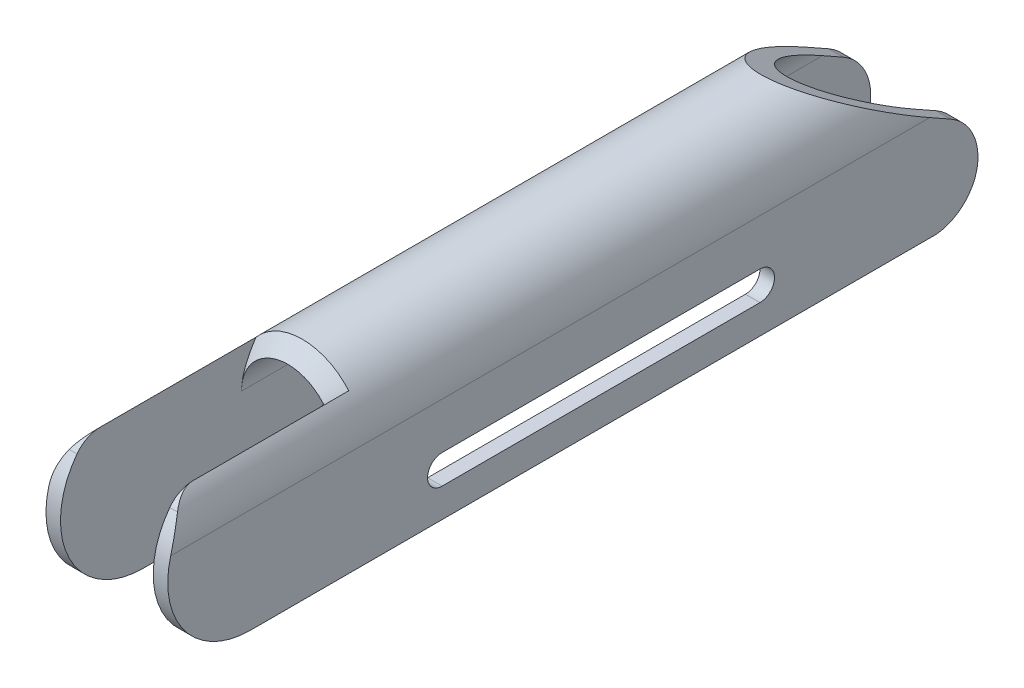
ISO-10303-21;
HEADER;
FILE_DESCRIPTION(('STEP AP214'),'2;1');
FILE_NAME('part.step','',(''),(''),'','','');
FILE_SCHEMA(('AUTOMOTIVE_DESIGN { 1 0 10303 214 1 1 1 1 }'));
ENDSEC;
DATA;
#1=APPLICATION_CONTEXT('core data for automotive mechanical design processes');
#2=APPLICATION_PROTOCOL_DEFINITION('international standard','automotive_design',2000,#1);
#3=PRODUCT_CONTEXT('',#1,'mechanical');
#4=PRODUCT('Part','Part','',(#3));
#5=PRODUCT_RELATED_PRODUCT_CATEGORY('part','',(#4));
#6=PRODUCT_DEFINITION_FORMATION('','',#4);
#7=PRODUCT_DEFINITION_CONTEXT('part definition',#1,'design');
#8=PRODUCT_DEFINITION('design','',#6,#7);
#9=PRODUCT_DEFINITION_SHAPE('','',#8);
#10=(LENGTH_UNIT() NAMED_UNIT(*) SI_UNIT(.MILLI.,.METRE.));
#11=(NAMED_UNIT(*) PLANE_ANGLE_UNIT() SI_UNIT($,.RADIAN.));
#12=(NAMED_UNIT(*) SI_UNIT($,.STERADIAN.) SOLID_ANGLE_UNIT());
#13=UNCERTAINTY_MEASURE_WITH_UNIT(LENGTH_MEASURE(1.E-05),#10,'distance_accuracy_value','');
#14=(GEOMETRIC_REPRESENTATION_CONTEXT(3) GLOBAL_UNCERTAINTY_ASSIGNED_CONTEXT((#13)) GLOBAL_UNIT_ASSIGNED_CONTEXT((#10,
#11,#12)) REPRESENTATION_CONTEXT('',''));
#15=CARTESIAN_POINT('',(0.,0.,0.));
#16=DIRECTION('',(0.,0.,1.));
#17=DIRECTION('',(1.,0.,0.));
#18=AXIS2_PLACEMENT_3D('',#15,#16,#17);
#19=CARTESIAN_POINT('',(0.,-7.50000000000001,-29.));
#20=DIRECTION('',(1.,0.,0.));
#21=DIRECTION('',(0.,1.,0.));
#22=AXIS2_PLACEMENT_3D('',#19,#20,#21);
#23=CYLINDRICAL_SURFACE('',#22,28.5);
#24=CARTESIAN_POINT('',(42.,0.,-1.50454583026493));
#25=CARTESIAN_POINT('',(42.0000078379844,0.281470430875846,-1.58131301805682));
#26=CARTESIAN_POINT('',(41.9943413318674,0.561740207267291,-1.66241637302954));
#27=CARTESIAN_POINT('',(41.9720066577336,1.11922274394459,-1.83303817373724));
#28=CARTESIAN_POINT('',(41.9553400441765,1.3964359305401,-1.92255542894493));
#29=CARTESIAN_POINT('',(41.9113797237989,1.9468821738609,-2.10965157391276));
#30=CARTESIAN_POINT('',(41.8840994447651,2.22011980888742,-2.20722015520436));
#31=CARTESIAN_POINT('',(41.819309776778,2.76241562024756,-2.41021454650773));
#32=CARTESIAN_POINT('',(41.7818000618385,3.03147366309939,-2.51564060683947));
#33=CARTESIAN_POINT('',(41.655331928854,3.82666973610311,-2.84120938033964));
#34=CARTESIAN_POINT('',(41.5519985119814,4.34609315288129,-3.07243830644598));
#35=CARTESIAN_POINT('',(41.3102299484671,5.36360743197751,-3.56190490619865));
#36=CARTESIAN_POINT('',(41.1717841069802,5.86169174051702,-3.82015079479918));
#37=CARTESIAN_POINT('',(40.8641394191691,6.83180401780029,-4.35946882580729));
#38=CARTESIAN_POINT('',(40.6951034497619,7.30395350367233,-4.64041590857864));
#39=CARTESIAN_POINT('',(40.3292172039968,8.22351884394188,-5.22359514287313));
#40=CARTESIAN_POINT('',(40.1323696194308,8.67093708616892,-5.52582523306799));
#41=CARTESIAN_POINT('',(39.7135032403053,9.54141885497119,-6.14988940163068));
#42=CARTESIAN_POINT('',(39.4914233646026,9.96441937585143,-6.47177013970007));
#43=CARTESIAN_POINT('',(39.0253876652276,10.7846170413226,-7.13221207385049));
#44=CARTESIAN_POINT('',(38.7814267605344,11.1818081555614,-7.47077713595265));
#45=CARTESIAN_POINT('',(38.1285666021884,12.1711864215096,-8.36127340563184));
#46=CARTESIAN_POINT('',(37.7054236615783,12.7443192799115,-8.92404905873861));
#47=CARTESIAN_POINT('',(36.8203708950797,13.8277090342549,-10.0789451296059));
#48=CARTESIAN_POINT('',(36.3584438011644,14.3379376708624,-10.6710785698923));
#49=CARTESIAN_POINT('',(35.4022717268348,15.2981857726764,-11.880134625509));
#50=CARTESIAN_POINT('',(34.9079644930189,15.748083870486,-12.497104057161));
#51=CARTESIAN_POINT('',(33.893976738655,16.5885199433872,-13.7500072652915));
#52=CARTESIAN_POINT('',(33.3742971804384,16.9790601675199,-14.3859403221548));
#53=CARTESIAN_POINT('',(32.1232867617891,17.8335413503409,-15.905293018601));
#54=CARTESIAN_POINT('',(31.3832185479532,18.2731563267866,-16.7952528643429));
#55=CARTESIAN_POINT('',(29.8752918749372,19.051229488021,-18.5959291787661));
#56=CARTESIAN_POINT('',(29.107420673625,19.3896406159593,-19.5066550919103));
#57=CARTESIAN_POINT('',(27.5534414852356,19.9684477790964,-21.3411372421391));
#58=CARTESIAN_POINT('',(26.7673594796596,20.2089753381149,-22.2648742571665));
#59=CARTESIAN_POINT('',(25.1832407905418,20.5952591794473,-24.1210218038153));
#60=CARTESIAN_POINT('',(24.385210839267,20.7410669187981,-25.053427346478));
#61=CARTESIAN_POINT('',(23.1582075958513,20.8932138760748,-26.4850037652716));
#62=CARTESIAN_POINT('',(22.7313279510348,20.9328891607137,-26.9826808363621));
#63=CARTESIAN_POINT('',(21.8769468586524,20.9860433475811,-27.9783847655471));
#64=CARTESIAN_POINT('',(21.4494460695991,20.9995408684445,-28.4764111228283));
#65=CARTESIAN_POINT('',(21.0146611411726,20.9999961612058,-28.9829202873666));
#66=CARTESIAN_POINT('',(21.0073305624724,20.9999999995566,-28.9914601531068));
#67=CARTESIAN_POINT('',(21.,21.,-29.));
#68=B_SPLINE_CURVE_WITH_KNOTS('',3,(#24,#25,#26,#27,#28,#29,#30,#31,#32,#33,#34,#35,#36,#37,#38,
#39,#40,#41,#42,#43,#44,#45,#46,#47,#48,#49,#50,#51,#52,#53,#54,#55,#56,#57,#58,#59,#60,#61,#62,
#63,#64,#65,#66,#67),.UNSPECIFIED.,.F.,.F.,(4,2,2,2,2,2,2,2,2,2,2,2,2,2,2,2,2,2,2,2,2,4),(0.,
0.875137417471462,1.75015119299242,2.62406153347569,3.49799972650496,5.22920387958742,
6.96093597237464,8.68370514364832,10.4063076880212,12.1331728345623,13.8604400219594,
16.5799329245868,19.3006431249376,22.0267470178365,24.7527475942157,28.461893447742,
32.1727612744409,35.8786263008895,39.5824764094682,41.5526850445835,43.5214918767296,
43.5552557647255),.UNSPECIFIED.);
#69=CARTESIAN_POINT('',(39.6760943348516,9.60226537832217,-6.20169920960243));
#70=VERTEX_POINT('',#69);
#71=CARTESIAN_POINT('',(42.,0.,-1.50454583026496));
#72=VERTEX_POINT('',#71);
#73=EDGE_CURVE('E386',#70,#72,#68,.F.);
#74=ORIENTED_EDGE('',*,*,#73,.F.);
#75=DIRECTION('',(-1.,0.,0.));
#76=VECTOR('',#75,1.);
#77=CARTESIAN_POINT('',(42.,9.60226537832218,-6.20169920960243));
#78=LINE('',#77,#76);
#79=CARTESIAN_POINT('',(37.,9.60226537832218,-6.20169920960243));
#80=VERTEX_POINT('',#79);
#81=EDGE_CURVE('E283',#70,#80,#78,.T.);
#82=ORIENTED_EDGE('',*,*,#81,.T.);
#83=CARTESIAN_POINT('',(37.,-7.5,-29.));
#84=DIRECTION('',(1.,0.,0.));
#85=DIRECTION('',(0.,0.,-1.));
#86=AXIS2_PLACEMENT_3D('',#83,#84,#85);
#87=CIRCLE('',#86,28.5);
#88=CARTESIAN_POINT('',(37.,-36.,-29.));
#89=VERTEX_POINT('',#88);
#90=EDGE_CURVE('E460',#89,#80,#87,.F.);
#91=ORIENTED_EDGE('',*,*,#90,.F.);
#92=DIRECTION('',(1.,0.,0.));
#93=VECTOR('',#92,1.);
#94=CARTESIAN_POINT('',(0.,-36.,-29.));
#95=LINE('',#94,#93);
#96=CARTESIAN_POINT('',(42.,-36.,-29.));
#97=VERTEX_POINT('',#96);
#98=EDGE_CURVE('E380',#89,#97,#95,.T.);
#99=ORIENTED_EDGE('',*,*,#98,.T.);
#100=CARTESIAN_POINT('',(42.,-7.5,-29.));
#101=DIRECTION('',(1.,0.,0.));
#102=DIRECTION('',(0.,1.,0.));
#103=AXIS2_PLACEMENT_3D('',#100,#101,#102);
#104=CIRCLE('',#103,28.5);
#105=EDGE_CURVE('E371',#72,#97,#104,.T.);
#106=ORIENTED_EDGE('',*,*,#105,.F.);
#107=EDGE_LOOP('',(#74,#82,#91,#99,#106));
#108=FACE_BOUND('',#107,.T.);
#109=ADVANCED_FACE('F57',(#108),#23,.T.);
#110=CARTESIAN_POINT('',(37.,0.,-0.5));
#111=DIRECTION('',(1.,0.,0.));
#112=DIRECTION('',(0.,0.,-1.));
#113=AXIS2_PLACEMENT_3D('',#110,#111,#112);
#114=PLANE('',#113);
#115=DIRECTION('',(0.,0.,-1.));
#116=VECTOR('',#115,1.);
#117=CARTESIAN_POINT('',(37.,-25.9821866375263,-0.5));
#118=LINE('',#117,#116);
#119=CARTESIAN_POINT('',(37.,-25.9821866375263,-95.14093430841));
#120=VERTEX_POINT('',#119);
#121=CARTESIAN_POINT('',(37.,-25.9821866375263,-204.781024531025));
#122=VERTEX_POINT('',#121);
#123=EDGE_CURVE('E267',#120,#122,#118,.T.);
#124=ORIENTED_EDGE('',*,*,#123,.T.);
#125=CARTESIAN_POINT('',(37.,-20.9700682273497,-204.781024531025));
#126=DIRECTION('',(1.,0.,0.));
#127=DIRECTION('',(0.,0.,-1.));
#128=AXIS2_PLACEMENT_3D('',#125,#126,#127);
#129=CIRCLE('',#128,5.01211841017668);
#130=CARTESIAN_POINT('',(37.,-15.957949817173,-204.781024531025));
#131=VERTEX_POINT('',#130);
#132=EDGE_CURVE('E225',#122,#131,#129,.T.);
#133=ORIENTED_EDGE('',*,*,#132,.T.);
#134=DIRECTION('',(0.,0.,-1.));
#135=VECTOR('',#134,1.);
#136=CARTESIAN_POINT('',(37.,-15.957949817173,-0.5));
#137=LINE('',#136,#135);
#138=CARTESIAN_POINT('',(37.,-15.957949817173,-95.14093430841));
#139=VERTEX_POINT('',#138);
#140=EDGE_CURVE('E277',#139,#131,#137,.T.);
#141=ORIENTED_EDGE('',*,*,#140,.F.);
#142=CARTESIAN_POINT('',(37.,-20.9700682273497,-95.14093430841));
#143=DIRECTION('',(1.,0.,0.));
#144=DIRECTION('',(0.,0.,-1.));
#145=AXIS2_PLACEMENT_3D('',#142,#143,#144);
#146=CIRCLE('',#145,5.01211841017668);
#147=EDGE_CURVE('E272',#139,#120,#146,.T.);
#148=ORIENTED_EDGE('',*,*,#147,.T.);
#149=EDGE_LOOP('',(#124,#133,#141,#148));
#150=FACE_BOUND('',#149,.T.);
#151=CARTESIAN_POINT('',(37.,3.60147050873545,-14.2011029957068));
#152=DIRECTION('',(1.,0.,0.));
#153=DIRECTION('',(0.,0.,-1.));
#154=AXIS2_PLACEMENT_3D('',#151,#152,#153);
#155=CIRCLE('',#154,10.);
#156=CARTESIAN_POINT('',(37.,13.6014705087355,-14.2011029957068));
#157=VERTEX_POINT('',#156);
#158=EDGE_CURVE('E318',#157,#80,#155,.T.);
#159=ORIENTED_EDGE('',*,*,#158,.F.);
#160=DIRECTION('',(0.,0.,1.));
#161=VECTOR('',#160,1.);
#162=CARTESIAN_POINT('',(37.,13.6014705087354,-280.));
#163=LINE('',#162,#161);
#164=CARTESIAN_POINT('',(37.,13.6014705087354,-67.9421378990617));
#165=VERTEX_POINT('',#164);
#166=EDGE_CURVE('E323',#157,#165,#163,.F.);
#167=ORIENTED_EDGE('',*,*,#166,.T.);
#168=CARTESIAN_POINT('',(37.,13.6014705087354,-67.9421378990617));
#169=CARTESIAN_POINT('',(37.,13.263718050929,-67.723419434942));
#170=CARTESIAN_POINT('',(37.,12.9238178955374,-67.507962041322));
#171=CARTESIAN_POINT('',(37.,12.2391410477654,-67.0847220094933));
#172=CARTESIAN_POINT('',(37.,11.8943629618573,-66.876941628283));
#173=CARTESIAN_POINT('',(37.,11.197840655012,-66.4693395300177));
#174=CARTESIAN_POINT('',(37.,10.8460705509863,-66.2695618749321));
#175=CARTESIAN_POINT('',(37.,10.1367444516397,-65.8806063789175));
#176=CARTESIAN_POINT('',(37.,9.77918895601471,-65.6914276287719));
#177=CARTESIAN_POINT('',(37.,9.06890906215404,-65.3311128584169));
#178=CARTESIAN_POINT('',(37.,8.71637729146691,-65.1595997599552));
#179=CARTESIAN_POINT('',(37.,8.00503153134776,-64.8301536421173));
#180=CARTESIAN_POINT('',(37.,7.64621695598859,-64.6722218975288));
#181=CARTESIAN_POINT('',(37.,6.56114402741744,-64.222645529841));
#182=CARTESIAN_POINT('',(37.,5.82471260692834,-63.9544161610302));
#183=CARTESIAN_POINT('',(37.,4.66796143282101,-63.6046342050249));
#184=CARTESIAN_POINT('',(37.,4.25642521324329,-63.4936989703165));
#185=CARTESIAN_POINT('',(37.,3.42668837391906,-63.3000015297154));
#186=CARTESIAN_POINT('',(37.,3.00848877864559,-63.2172350358956));
#187=CARTESIAN_POINT('',(37.,2.37411761174278,-63.1159380780384));
#188=CARTESIAN_POINT('',(37.,2.15974395706909,-63.0858353727216));
#189=CARTESIAN_POINT('',(37.,1.72998061884875,-63.0339791563646));
#190=CARTESIAN_POINT('',(37.,1.51459095692613,-63.0122254684338));
#191=CARTESIAN_POINT('',(37.,1.0828576108131,-62.9772950572886));
#192=CARTESIAN_POINT('',(37.,0.866513093271172,-62.9641286318523));
#193=CARTESIAN_POINT('',(37.,0.433447638017115,-62.9465409356701));
#194=CARTESIAN_POINT('',(37.,0.216726664310944,-62.9421205531201));
#195=CARTESIAN_POINT('',(37.,0.,-62.9421378990618));
#196=B_SPLINE_CURVE_WITH_KNOTS('',3,(#168,#169,#170,#171,#172,#173,#174,#175,#176,#177,#178,
#179,#180,#181,#182,#183,#184,#185,#186,#187,#188,#189,#190,#191,#192,#193,#194,#195),
.UNSPECIFIED.,.F.,.F.,(4,2,2,2,2,2,2,2,2,2,2,2,2,4),(0.,1.2071836367896,2.41471939964957,
3.62818123298593,4.8415388108165,6.01736775827695,7.1933069524809,9.53997733565896,
10.8178887138565,12.0956054775984,12.7449013568247,13.3941834786645,14.0442427898744,
14.6943681138336),.UNSPECIFIED.);
#197=CARTESIAN_POINT('',(37.,0.,-62.9421378990618));
#198=VERTEX_POINT('',#197);
#199=EDGE_CURVE('E67',#165,#198,#196,.T.);
#200=ORIENTED_EDGE('',*,*,#199,.T.);
#201=DIRECTION('',(0.,0.,-1.));
#202=VECTOR('',#201,1.);
#203=CARTESIAN_POINT('',(37.,0.,-0.5));
#204=LINE('',#203,#202);
#205=CARTESIAN_POINT('',(37.,0.,-263.367084443122));
#206=VERTEX_POINT('',#205);
#207=EDGE_CURVE('E369',#198,#206,#204,.T.);
#208=ORIENTED_EDGE('',*,*,#207,.T.);
#209=DIRECTION('',(0.,0.490748224951297,0.871301428730122));
#210=VECTOR('',#209,1.);
#211=CARTESIAN_POINT('',(37.,112.399239257091,-63.8072841756799));
#212=LINE('',#211,#210);
#213=CARTESIAN_POINT('',(37.,-4.05416859300339,-270.565078664593));
#214=VERTEX_POINT('',#213);
#215=EDGE_CURVE('E363',#214,#206,#212,.T.);
#216=ORIENTED_EDGE('',*,*,#215,.F.);
#217=CARTESIAN_POINT('',(37.,-20.1967936014485,-261.472973099594));
#218=DIRECTION('',(1.,0.,0.));
#219=DIRECTION('',(0.,0.,-1.));
#220=AXIS2_PLACEMENT_3D('',#217,#218,#219);
#221=CIRCLE('',#220,18.5270269004059);
#222=CARTESIAN_POINT('',(37.,-20.1967936014485,-280.));
#223=VERTEX_POINT('',#222);
#224=EDGE_CURVE('E354',#223,#214,#221,.T.);
#225=ORIENTED_EDGE('',*,*,#224,.F.);
#226=CARTESIAN_POINT('',(37.,-20.1967936014485,-264.133140838564));
#227=DIRECTION('',(1.,0.,0.));
#228=DIRECTION('',(0.,0.,-1.));
#229=AXIS2_PLACEMENT_3D('',#226,#227,#228);
#230=CIRCLE('',#229,15.8668591614362);
#231=CARTESIAN_POINT('',(37.,-36.,-265.552960254417));
#232=VERTEX_POINT('',#231);
#233=EDGE_CURVE('E337',#232,#223,#230,.T.);
#234=ORIENTED_EDGE('',*,*,#233,.F.);
#235=DIRECTION('',(0.,0.,-1.));
#236=VECTOR('',#235,1.);
#237=CARTESIAN_POINT('',(37.,-36.,-0.5));
#238=LINE('',#237,#236);
#239=EDGE_CURVE('E368',#89,#232,#238,.T.);
#240=ORIENTED_EDGE('',*,*,#239,.F.);
#241=ORIENTED_EDGE('',*,*,#90,.T.);
#242=EDGE_LOOP('',(#159,#167,#200,#208,#216,#225,#234,#240,#241));
#243=FACE_BOUND('',#242,.T.);
#244=ADVANCED_FACE('F403',(#150,#243),#114,.F.);
#245=CARTESIAN_POINT('',(5.,0.,-0.5));
#246=DIRECTION('',(-1.,0.,0.));
#247=DIRECTION('',(0.,0.,1.));
#248=AXIS2_PLACEMENT_3D('',#245,#246,#247);
#249=PLANE('',#248);
#250=DIRECTION('',(0.,0.,1.));
#251=VECTOR('',#250,1.);
#252=CARTESIAN_POINT('',(5.,-15.957949817173,-0.5));
#253=LINE('',#252,#251);
#254=CARTESIAN_POINT('',(5.,-15.957949817173,-204.781024531025));
#255=VERTEX_POINT('',#254);
#256=CARTESIAN_POINT('',(5.,-15.957949817173,-95.14093430841));
#257=VERTEX_POINT('',#256);
#258=EDGE_CURVE('E275',#255,#257,#253,.T.);
#259=ORIENTED_EDGE('',*,*,#258,.F.);
#260=CARTESIAN_POINT('',(5.,-20.9700682273497,-204.781024531025));
#261=DIRECTION('',(-1.,0.,0.));
#262=DIRECTION('',(0.,0.,1.));
#263=AXIS2_PLACEMENT_3D('',#260,#261,#262);
#264=CIRCLE('',#263,5.01211841017668);
#265=CARTESIAN_POINT('',(5.,-25.9821866375263,-204.781024531025));
#266=VERTEX_POINT('',#265);
#267=EDGE_CURVE('E279',#255,#266,#264,.T.);
#268=ORIENTED_EDGE('',*,*,#267,.T.);
#269=DIRECTION('',(0.,0.,1.));
#270=VECTOR('',#269,1.);
#271=CARTESIAN_POINT('',(5.,-25.9821866375263,-0.5));
#272=LINE('',#271,#270);
#273=CARTESIAN_POINT('',(5.,-25.9821866375263,-95.14093430841));
#274=VERTEX_POINT('',#273);
#275=EDGE_CURVE('E258',#266,#274,#272,.T.);
#276=ORIENTED_EDGE('',*,*,#275,.T.);
#277=CARTESIAN_POINT('',(5.,-20.9700682273497,-95.14093430841));
#278=DIRECTION('',(-1.,0.,0.));
#279=DIRECTION('',(0.,0.,1.));
#280=AXIS2_PLACEMENT_3D('',#277,#278,#279);
#281=CIRCLE('',#280,5.01211841017668);
#282=EDGE_CURVE('E269',#274,#257,#281,.T.);
#283=ORIENTED_EDGE('',*,*,#282,.T.);
#284=EDGE_LOOP('',(#259,#268,#276,#283));
#285=FACE_BOUND('',#284,.T.);
#286=CARTESIAN_POINT('',(5.,3.60147050873545,-14.2011029957068));
#287=DIRECTION('',(-1.,0.,0.));
#288=DIRECTION('',(0.,0.,1.));
#289=AXIS2_PLACEMENT_3D('',#286,#287,#288);
#290=CIRCLE('',#289,10.);
#291=CARTESIAN_POINT('',(5.,9.60226537832217,-6.20169920960243));
#292=VERTEX_POINT('',#291);
#293=CARTESIAN_POINT('',(5.,13.6014705087354,-14.2011029957068));
#294=VERTEX_POINT('',#293);
#295=EDGE_CURVE('E294',#292,#294,#290,.T.);
#296=ORIENTED_EDGE('',*,*,#295,.F.);
#297=CARTESIAN_POINT('',(5.,-7.5,-29.));
#298=DIRECTION('',(-1.,0.,0.));
#299=DIRECTION('',(0.,0.,1.));
#300=AXIS2_PLACEMENT_3D('',#297,#298,#299);
#301=CIRCLE('',#300,28.5);
#302=CARTESIAN_POINT('',(5.,-36.,-29.));
#303=VERTEX_POINT('',#302);
#304=EDGE_CURVE('E444',#292,#303,#301,.F.);
#305=ORIENTED_EDGE('',*,*,#304,.T.);
#306=DIRECTION('',(0.,0.,-1.));
#307=VECTOR('',#306,1.);
#308=CARTESIAN_POINT('',(5.,-36.,-0.5));
#309=LINE('',#308,#307);
#310=CARTESIAN_POINT('',(5.00000000000002,-36.,-265.552960254417));
#311=VERTEX_POINT('',#310);
#312=EDGE_CURVE('E374',#303,#311,#309,.T.);
#313=ORIENTED_EDGE('',*,*,#312,.T.);
#314=CARTESIAN_POINT('',(5.00000000000001,-20.1967936014485,-264.133140838564));
#315=DIRECTION('',(-1.,0.,0.));
#316=DIRECTION('',(0.,0.,1.));
#317=AXIS2_PLACEMENT_3D('',#314,#315,#316);
#318=CIRCLE('',#317,15.8668591614362);
#319=CARTESIAN_POINT('',(5.00000000000004,-20.1967936014485,-280.));
#320=VERTEX_POINT('',#319);
#321=EDGE_CURVE('E334',#320,#311,#318,.T.);
#322=ORIENTED_EDGE('',*,*,#321,.F.);
#323=CARTESIAN_POINT('',(5.00000000000001,-20.1967936014485,-261.472973099594));
#324=DIRECTION('',(-1.,0.,0.));
#325=DIRECTION('',(0.,0.,1.));
#326=AXIS2_PLACEMENT_3D('',#323,#324,#325);
#327=CIRCLE('',#326,18.5270269004059);
#328=CARTESIAN_POINT('',(5.00000000000001,-4.0541685930034,-270.565078664593));
#329=VERTEX_POINT('',#328);
#330=EDGE_CURVE('E433',#329,#320,#327,.T.);
#331=ORIENTED_EDGE('',*,*,#330,.F.);
#332=DIRECTION('',(0.,-0.490748224951297,-0.871301428730122));
#333=VECTOR('',#332,1.);
#334=CARTESIAN_POINT('',(5.,112.399239257091,-63.8072841756799));
#335=LINE('',#334,#333);
#336=CARTESIAN_POINT('',(5.,0.,-263.367084443122));
#337=VERTEX_POINT('',#336);
#338=EDGE_CURVE('E464',#337,#329,#335,.T.);
#339=ORIENTED_EDGE('',*,*,#338,.F.);
#340=DIRECTION('',(0.,0.,-1.));
#341=VECTOR('',#340,1.);
#342=CARTESIAN_POINT('',(5.,0.,-0.5));
#343=LINE('',#342,#341);
#344=CARTESIAN_POINT('',(5.,0.,-62.9421378990618));
#345=VERTEX_POINT('',#344);
#346=EDGE_CURVE('E372',#345,#337,#343,.T.);
#347=ORIENTED_EDGE('',*,*,#346,.F.);
#348=CARTESIAN_POINT('',(5.,0.,-62.9421378990618));
#349=CARTESIAN_POINT('',(5.,0.246004910404687,-62.9421092571691));
#350=CARTESIAN_POINT('',(5.,0.491999891151692,-62.9478107458918));
#351=CARTESIAN_POINT('',(5.,0.983432736587085,-62.9704610776742));
#352=CARTESIAN_POINT('',(5.,1.22887068556927,-62.9874080867985));
#353=CARTESIAN_POINT('',(5.,1.71826302897797,-63.0322935994943));
#354=CARTESIAN_POINT('',(5.,1.96221936584451,-63.060210961466));
#355=CARTESIAN_POINT('',(5.,2.44867580819842,-63.1266343356005));
#356=CARTESIAN_POINT('',(5.,2.69117586554767,-63.165140695841));
#357=CARTESIAN_POINT('',(5.,3.4076066707319,-63.2943216865122));
#358=CARTESIAN_POINT('',(5.,3.87898781500665,-63.3994751719512));
#359=CARTESIAN_POINT('',(5.,4.8127090862544,-63.6441974052271));
#360=CARTESIAN_POINT('',(5.,5.27504562949576,-63.7837795080691));
#361=CARTESIAN_POINT('',(5.,6.4216970467778,-64.1705116139204));
#362=CARTESIAN_POINT('',(5.,7.09973936221092,-64.4363228960585));
#363=CARTESIAN_POINT('',(5.,8.10008762797221,-64.8731545036756));
#364=CARTESIAN_POINT('',(5.,8.43097610019606,-65.0252368777843));
#365=CARTESIAN_POINT('',(5.,9.08744118724298,-65.3404717904595));
#366=CARTESIAN_POINT('',(5.,9.41301815394355,-65.5036235919723));
#367=CARTESIAN_POINT('',(5.,10.0682553515624,-65.8442339410452));
#368=CARTESIAN_POINT('',(5.,10.3977726607346,-66.0219658919964));
#369=CARTESIAN_POINT('',(5.,11.0519409460647,-66.3862013737941));
#370=CARTESIAN_POINT('',(5.,11.3765916163465,-66.5727054529601));
#371=CARTESIAN_POINT('',(5.,12.0203146740112,-66.9526503471661));
#372=CARTESIAN_POINT('',(5.,12.3394022103551,-67.146065577336));
#373=CARTESIAN_POINT('',(5.,12.9734316595597,-67.5394302804268));
#374=CARTESIAN_POINT('',(5.,13.2883744612602,-67.7393783192643));
#375=CARTESIAN_POINT('',(5.,13.6014705087354,-67.9421378990617));
#376=B_SPLINE_CURVE_WITH_KNOTS('',3,(#348,#349,#350,#351,#352,#353,#354,#355,#356,#357,#358,
#359,#360,#361,#362,#363,#364,#365,#366,#367,#368,#369,#370,#371,#372,#373,#374,#375),
.UNSPECIFIED.,.F.,.F.,(4,2,2,2,2,2,2,2,2,2,2,2,2,4),(0.,0.737932165397774,1.47574401734757,
2.21214090832267,2.94856200877401,4.3958102794283,5.84362082908151,8.02530955688601,
9.11767863359025,10.2099750465455,11.3330097202443,12.4561146850094,13.5754224581997,
14.694486150171),.UNSPECIFIED.);
#377=CARTESIAN_POINT('',(5.,13.6014705087354,-67.9421378990617));
#378=VERTEX_POINT('',#377);
#379=EDGE_CURVE('E471',#345,#378,#376,.T.);
#380=ORIENTED_EDGE('',*,*,#379,.T.);
#381=DIRECTION('',(0.,0.,1.));
#382=VECTOR('',#381,1.);
#383=CARTESIAN_POINT('',(5.,13.6014705087354,-280.));
#384=LINE('',#383,#382);
#385=EDGE_CURVE('E320',#378,#294,#384,.T.);
#386=ORIENTED_EDGE('',*,*,#385,.T.);
#387=EDGE_LOOP('',(#296,#305,#313,#322,#331,#339,#347,#380,#386));
#388=FACE_BOUND('',#387,.T.);
#389=ADVANCED_FACE('F440',(#285,#388),#249,.F.);
#390=CARTESIAN_POINT('',(21.,0.,-280.));
#391=DIRECTION('',(0.,0.,1.));
#392=DIRECTION('',(1.,0.,0.));
#393=AXIS2_PLACEMENT_3D('',#390,#391,#392);
#394=CYLINDRICAL_SURFACE('',#393,21.);
#395=ORIENTED_EDGE('',*,*,#166,.F.);
#396=CARTESIAN_POINT('',(37.,13.6014705087355,-14.2011029957068));
#397=CARTESIAN_POINT('',(36.9999959260871,13.6014722212831,-14.0787313261895));
#398=CARTESIAN_POINT('',(37.0019103249348,13.5992236706587,-13.9563791945962));
#399=CARTESIAN_POINT('',(37.0095340891215,13.5902490445869,-13.7119666641634));
#400=CARTESIAN_POINT('',(37.0152431691821,13.5835233057279,-13.5899062440856));
#401=CARTESIAN_POINT('',(37.0379801085316,13.556687663528,-13.2248317792188));
#402=CARTESIAN_POINT('',(37.060617887496,13.5299192046865,-12.9826038693524));
#403=CARTESIAN_POINT('',(37.1196981478437,13.4594724254538,-12.5047476665934));
#404=CARTESIAN_POINT('',(37.1560094690215,13.4159546835949,-12.2690788278715));
#405=CARTESIAN_POINT('',(37.2411631701418,13.312741599342,-11.8035912395289));
#406=CARTESIAN_POINT('',(37.2900082163384,13.2530428146613,-11.573773746092));
#407=CARTESIAN_POINT('',(37.3984458261928,13.11862707255,-11.1223096990715));
#408=CARTESIAN_POINT('',(37.4579921817392,13.0439745323265,-10.9006327658856));
#409=CARTESIAN_POINT('',(37.5863057843735,12.880422701434,-10.4654466533369));
#410=CARTESIAN_POINT('',(37.6550728229616,12.7915237328991,-10.2519372894277));
#411=CARTESIAN_POINT('',(37.8731992735144,12.5041143012532,-9.62339580017659));
#412=CARTESIAN_POINT('',(38.0341171392904,12.2852110385435,-9.22140588033553));
#413=CARTESIAN_POINT('',(38.3002633324917,11.9050064964039,-8.62282753172569));
#414=CARTESIAN_POINT('',(38.3993723151334,11.7599042102931,-8.4127757783696));
#415=CARTESIAN_POINT('',(38.6015735406432,11.4550433275352,-8.00545561497193));
#416=CARTESIAN_POINT('',(38.7046665360163,11.2952819541541,-7.80818963894628));
#417=CARTESIAN_POINT('',(38.9128051925502,10.9622045998699,-7.42736686296677));
#418=CARTESIAN_POINT('',(39.017846871552,10.7889143441198,-7.24378528229151));
#419=CARTESIAN_POINT('',(39.2284545515946,10.4291353577546,-6.89038900971974));
#420=CARTESIAN_POINT('',(39.3340204601233,10.2426488839763,-6.7205719743969));
#421=CARTESIAN_POINT('',(39.4787892083806,9.97703591691076,-6.49647743130492));
#422=CARTESIAN_POINT('',(39.5184283123081,9.9032797719565,-6.43603354197548));
#423=CARTESIAN_POINT('',(39.5974571608396,9.75406098306906,-6.31727705097446));
#424=CARTESIAN_POINT('',(39.6368470890999,9.67859984637454,-6.25896267758613));
#425=CARTESIAN_POINT('',(39.6760943348516,9.6022653783222,-6.2016992096024));
#426=B_SPLINE_CURVE_WITH_KNOTS('',3,(#396,#397,#398,#399,#400,#401,#402,#403,#404,#405,#406,
#407,#408,#409,#410,#411,#412,#413,#414,#415,#416,#417,#418,#419,#420,#421,#422,#423,#424,#425),
.UNSPECIFIED.,.F.,.F.,(4,2,2,2,2,2,2,2,2,2,2,2,2,2,4),(0.,0.367041061447377,0.73405453241337,
1.46712349280863,2.19333273592474,2.91969659115591,3.64299624953364,4.36627955527891,
5.81621716086307,6.63724872553856,7.45843613288467,8.27809840264017,9.0976208297512,
9.40740278442119,9.71692084516684),.UNSPECIFIED.);
#427=EDGE_CURVE('E311',#157,#70,#426,.T.);
#428=ORIENTED_EDGE('',*,*,#427,.T.);
#429=ORIENTED_EDGE('',*,*,#73,.T.);
#430=DIRECTION('',(0.,0.,1.));
#431=VECTOR('',#430,1.);
#432=CARTESIAN_POINT('',(42.,0.,-280.));
#433=LINE('',#432,#431);
#434=CARTESIAN_POINT('',(42.,0.,-263.367084443122));
#435=VERTEX_POINT('',#434);
#436=EDGE_CURVE('E455',#435,#72,#433,.T.);
#437=ORIENTED_EDGE('',*,*,#436,.F.);
#438=CARTESIAN_POINT('',(21.,0.,-263.367084443122));
#439=DIRECTION('',(0.,0.871301428730122,-0.490748224951297));
#440=DIRECTION('',(0.,0.490748224951297,0.871301428730122));
#441=AXIS2_PLACEMENT_3D('',#438,#439,#440);
#442=ELLIPSE('',#441,42.7918002191125,21.);
#443=CARTESIAN_POINT('',(0.,0.,-263.367084443122));
#444=VERTEX_POINT('',#443);
#445=EDGE_CURVE('E366',#435,#444,#442,.F.);
#446=ORIENTED_EDGE('',*,*,#445,.T.);
#447=DIRECTION('',(0.,0.,1.));
#448=VECTOR('',#447,1.);
#449=CARTESIAN_POINT('',(0.,0.,-280.));
#450=LINE('',#449,#448);
#451=CARTESIAN_POINT('',(0.,0.,-1.50454583026496));
#452=VERTEX_POINT('',#451);
#453=EDGE_CURVE('E451',#444,#452,#450,.T.);
#454=ORIENTED_EDGE('',*,*,#453,.T.);
#455=CARTESIAN_POINT('',(0.,0.,-1.50454583026493));
#456=CARTESIAN_POINT('',(-7.83798437847069E-06,0.281470430875844,-1.58131301805683));
#457=CARTESIAN_POINT('',(0.0056586681325985,0.561740207267289,-1.66241637302955));
#458=CARTESIAN_POINT('',(0.0279933422664537,1.11922274394459,-1.83303817373724));
#459=CARTESIAN_POINT('',(0.0446599558235473,1.39643593054011,-1.92255542894493));
#460=CARTESIAN_POINT('',(0.0886202762011343,1.9468821738609,-2.10965157391276));
#461=CARTESIAN_POINT('',(0.11590055523485,2.22011980888742,-2.20722015520436));
#462=CARTESIAN_POINT('',(0.180690223222032,2.76241562024756,-2.41021454650773));
#463=CARTESIAN_POINT('',(0.2181999381615,3.03147366309939,-2.51564060683947));
#464=CARTESIAN_POINT('',(0.344668071146015,3.82666973610311,-2.84120938033964));
#465=CARTESIAN_POINT('',(0.448001488018603,4.34609315288129,-3.07243830644598));
#466=CARTESIAN_POINT('',(0.68977005153293,5.36360743197751,-3.56190490619866));
#467=CARTESIAN_POINT('',(0.828215893019843,5.86169174051702,-3.82015079479919));
#468=CARTESIAN_POINT('',(1.13586058083086,6.83180401780029,-4.3594688258073));
#469=CARTESIAN_POINT('',(1.30489655023809,7.30395350367233,-4.64041590857864));
#470=CARTESIAN_POINT('',(1.67078279600315,8.22351884394188,-5.22359514287314));
#471=CARTESIAN_POINT('',(1.86763038056915,8.67093708616892,-5.525825233068));
#472=CARTESIAN_POINT('',(2.28649675969467,9.54141885497119,-6.14988940163068));
#473=CARTESIAN_POINT('',(2.50857663539743,9.96441937585143,-6.47177013970007));
#474=CARTESIAN_POINT('',(2.97461233477244,10.7846170413226,-7.13221207385049));
#475=CARTESIAN_POINT('',(3.21857323946558,11.1818081555614,-7.47077713595266));
#476=CARTESIAN_POINT('',(3.87143339781163,12.1711864215096,-8.36127340563185));
#477=CARTESIAN_POINT('',(4.29457633842175,12.7443192799115,-8.92404905873862));
#478=CARTESIAN_POINT('',(5.17962910492029,13.8277090342549,-10.0789451296059));
#479=CARTESIAN_POINT('',(5.6415561988356,14.3379376708624,-10.6710785698923));
#480=CARTESIAN_POINT('',(6.59772827316516,15.2981857726764,-11.880134625509));
#481=CARTESIAN_POINT('',(7.09203550698109,15.748083870486,-12.497104057161));
#482=CARTESIAN_POINT('',(8.10602326134499,16.5885199433872,-13.7500072652916));
#483=CARTESIAN_POINT('',(8.62570281956163,16.9790601675199,-14.3859403221548));
#484=CARTESIAN_POINT('',(9.87671323821092,17.8335413503409,-15.9052930186011));
#485=CARTESIAN_POINT('',(10.6167814520468,18.2731563267866,-16.7952528643429));
#486=CARTESIAN_POINT('',(12.1247081250628,19.051229488021,-18.5959291787661));
#487=CARTESIAN_POINT('',(12.8925793263751,19.3896406159593,-19.5066550919103));
#488=CARTESIAN_POINT('',(14.4465585147644,19.9684477790964,-21.3411372421392));
#489=CARTESIAN_POINT('',(15.2326405203404,20.2089753381149,-22.2648742571666));
#490=CARTESIAN_POINT('',(16.8167592094582,20.5952591794473,-24.1210218038153));
#491=CARTESIAN_POINT('',(17.6147891607332,20.7410669187981,-25.0534273464779));
#492=CARTESIAN_POINT('',(18.8417924041486,20.8932138760748,-26.4850037652717));
#493=CARTESIAN_POINT('',(19.268672048965,20.9328891607137,-26.9826808363623));
#494=CARTESIAN_POINT('',(20.1230531413478,20.9860433475811,-27.978384765547));
#495=CARTESIAN_POINT('',(20.5505539304017,20.9995408684445,-28.4764111228276));
#496=CARTESIAN_POINT('',(20.9853388588274,20.9999961612058,-28.9829202873666));
#497=CARTESIAN_POINT('',(20.9926694375276,20.9999999995566,-28.9914601531068));
#498=CARTESIAN_POINT('',(21.,21.,-29.));
#499=B_SPLINE_CURVE_WITH_KNOTS('',3,(#455,#456,#457,#458,#459,#460,#461,#462,#463,#464,#465,
#466,#467,#468,#469,#470,#471,#472,#473,#474,#475,#476,#477,#478,#479,#480,#481,#482,#483,#484,
#485,#486,#487,#488,#489,#490,#491,#492,#493,#494,#495,#496,#497,#498),.UNSPECIFIED.,.F.,.F.,(4,
2,2,2,2,2,2,2,2,2,2,2,2,2,2,2,2,2,2,2,2,4),(0.,0.875137417471463,1.75015119299242,
2.62406153347568,3.49799972650496,5.22920387958742,6.96093597237464,8.68370514364833,
10.4063076880212,12.1331728345623,13.8604400219594,16.5799329245868,19.3006431249376,
22.0267470178365,24.7527475942157,28.461893447742,32.172761274441,35.8786263008896,
39.5824764094682,41.5526850445835,43.5214918767295,43.5552557647254),.UNSPECIFIED.);
#500=CARTESIAN_POINT('',(2.32390566514842,9.60226537832217,-6.20169920960243));
#501=VERTEX_POINT('',#500);
#502=EDGE_CURVE('E393',#452,#501,#499,.T.);
#503=ORIENTED_EDGE('',*,*,#502,.T.);
#504=CARTESIAN_POINT('',(2.32390566514843,9.60226537832218,-6.20169920960242));
#505=CARTESIAN_POINT('',(2.44390042212317,9.83571021351452,-6.37685209530727));
#506=CARTESIAN_POINT('',(2.56531826178854,10.0610433271101,-6.56182624059294));
#507=CARTESIAN_POINT('',(2.80870730166818,10.4946857133886,-6.95068357433477));
#508=CARTESIAN_POINT('',(2.93067875959237,10.7029859596278,-7.15457666813359));
#509=CARTESIAN_POINT('',(3.17396829634467,11.1035186680669,-7.58249346848593));
#510=CARTESIAN_POINT('',(3.29526746398884,11.2955684451813,-7.80669902457346));
#511=CARTESIAN_POINT('',(3.53320465278868,11.6601198784686,-8.27272512491597));
#512=CARTESIAN_POINT('',(3.64984387978101,11.8326266132154,-8.51454106587124));
#513=CARTESIAN_POINT('',(3.85734505647982,12.1308242837756,-8.97493850071976));
#514=CARTESIAN_POINT('',(3.94934050158118,12.2595859971591,-9.19102407358832));
#515=CARTESIAN_POINT('',(4.12597986454351,12.5015955526635,-9.63474263136142));
#516=CARTESIAN_POINT('',(4.2106212727275,12.6148381061869,-9.86237951667318));
#517=CARTESIAN_POINT('',(4.36987491131646,12.8240448335633,-10.3270057209396));
#518=CARTESIAN_POINT('',(4.44454585308393,12.9201113986371,-10.5639285970091));
#519=CARTESIAN_POINT('',(4.58221963512073,13.0946114679583,-11.0473375678848));
#520=CARTESIAN_POINT('',(4.64523005108344,13.173056427872,-11.2938173268971));
#521=CARTESIAN_POINT('',(4.74875022620335,13.3004712468911,-11.7561824086189));
#522=CARTESIAN_POINT('',(4.79123382357457,13.3521252136209,-11.9708872403591));
#523=CARTESIAN_POINT('',(4.86514699606848,13.4413497090417,-12.4050324573449));
#524=CARTESIAN_POINT('',(4.89657957605771,13.4789240662826,-12.6244715380564));
#525=CARTESIAN_POINT('',(4.9476860929397,13.5397500348842,-13.069095095983));
#526=CARTESIAN_POINT('',(4.9672338236545,13.5628479970835,-13.2943156395555));
#527=CARTESIAN_POINT('',(4.98685547596551,13.585996130435,-13.6335368156981));
#528=CARTESIAN_POINT('',(4.99177940526097,13.5917957276698,-13.7469072508528));
#529=CARTESIAN_POINT('',(4.99835327261373,13.5995336628557,-13.9738809185299));
#530=CARTESIAN_POINT('',(5.00000302309129,13.6014717795802,-14.0874841640169));
#531=CARTESIAN_POINT('',(5.,13.6014705087354,-14.2011029957068));
#532=B_SPLINE_CURVE_WITH_KNOTS('',3,(#504,#505,#506,#507,#508,#509,#510,#511,#512,#513,#514,
#515,#516,#517,#518,#519,#520,#521,#522,#523,#524,#525,#526,#527,#528,#529,#530,#531),
.UNSPECIFIED.,.F.,.F.,(4,2,2,2,2,2,2,2,2,2,2,2,2,4),(0.,0.946390974121744,1.89328027399948,
2.84969352481628,3.80585766338759,4.60863113225549,5.41167749246162,6.20976427090951,
7.00733070821966,7.6812577698163,8.35500144287681,9.03578008492845,9.37655790339907,
9.71735524467941),.UNSPECIFIED.);
#533=EDGE_CURVE('E286',#501,#294,#532,.T.);
#534=ORIENTED_EDGE('',*,*,#533,.T.);
#535=ORIENTED_EDGE('',*,*,#385,.F.);
#536=CARTESIAN_POINT('',(21.,0.,-67.9421378990617));
#537=DIRECTION('',(0.,0.,-1.));
#538=DIRECTION('',(-1.,0.,0.));
#539=AXIS2_PLACEMENT_3D('',#536,#537,#538);
#540=CIRCLE('',#539,21.);
#541=EDGE_CURVE('E466',#378,#165,#540,.T.);
#542=ORIENTED_EDGE('',*,*,#541,.T.);
#543=EDGE_LOOP('',(#395,#428,#429,#437,#446,#454,#503,#534,#535,#542));
#544=FACE_BOUND('',#543,.T.);
#545=ADVANCED_FACE('F296',(#544),#394,.T.);
#546=ORIENTED_EDGE('',*,*,#304,.F.);
#547=DIRECTION('',(-1.,0.,0.));
#548=VECTOR('',#547,1.);
#549=CARTESIAN_POINT('',(21.,9.60226537832217,-6.20169920960242));
#550=LINE('',#549,#548);
#551=EDGE_CURVE('E12',#292,#501,#550,.T.);
#552=ORIENTED_EDGE('',*,*,#551,.T.);
#553=ORIENTED_EDGE('',*,*,#502,.F.);
#554=CARTESIAN_POINT('',(0.,-7.50000000000001,-29.));
#555=DIRECTION('',(1.,0.,0.));
#556=DIRECTION('',(0.,1.,0.));
#557=AXIS2_PLACEMENT_3D('',#554,#555,#556);
#558=CIRCLE('',#557,28.5);
#559=CARTESIAN_POINT('',(0.,-36.,-29.));
#560=VERTEX_POINT('',#559);
#561=EDGE_CURVE('E377',#452,#560,#558,.T.);
#562=ORIENTED_EDGE('',*,*,#561,.T.);
#563=EDGE_CURVE('E383',#560,#303,#95,.T.);
#564=ORIENTED_EDGE('',*,*,#563,.T.);
#565=EDGE_LOOP('',(#546,#552,#553,#562,#564));
#566=FACE_BOUND('',#565,.T.);
#567=ADVANCED_FACE('F405',(#566),#23,.T.);
#568=CARTESIAN_POINT('',(42.,0.,-280.));
#569=DIRECTION('',(1.,0.,0.));
#570=DIRECTION('',(0.,1.,0.));
#571=AXIS2_PLACEMENT_3D('',#568,#569,#570);
#572=PLANE('',#571);
#573=CARTESIAN_POINT('',(42.,-20.9700682273497,-204.781024531025));
#574=DIRECTION('',(-1.,0.,0.));
#575=DIRECTION('',(0.,-1.,0.));
#576=AXIS2_PLACEMENT_3D('',#573,#574,#575);
#577=CIRCLE('',#576,5.01211841017668);
#578=CARTESIAN_POINT('',(42.,-15.957949817173,-204.781024531025));
#579=VERTEX_POINT('',#578);
#580=CARTESIAN_POINT('',(42.,-25.9821866375263,-204.781024531025));
#581=VERTEX_POINT('',#580);
#582=EDGE_CURVE('E222',#579,#581,#577,.T.);
#583=ORIENTED_EDGE('',*,*,#582,.T.);
#584=DIRECTION('',(0.,0.,1.));
#585=VECTOR('',#584,1.);
#586=CARTESIAN_POINT('',(42.,-25.9821866375263,-204.781024531025));
#587=LINE('',#586,#585);
#588=CARTESIAN_POINT('',(42.,-25.9821866375263,-95.14093430841));
#589=VERTEX_POINT('',#588);
#590=EDGE_CURVE('E231',#581,#589,#587,.T.);
#591=ORIENTED_EDGE('',*,*,#590,.T.);
#592=CARTESIAN_POINT('',(42.,-20.9700682273497,-95.14093430841));
#593=DIRECTION('',(-1.,0.,0.));
#594=DIRECTION('',(0.,-1.,0.));
#595=AXIS2_PLACEMENT_3D('',#592,#593,#594);
#596=CIRCLE('',#595,5.01211841017668);
#597=CARTESIAN_POINT('',(42.,-15.957949817173,-95.14093430841));
#598=VERTEX_POINT('',#597);
#599=EDGE_CURVE('E237',#589,#598,#596,.T.);
#600=ORIENTED_EDGE('',*,*,#599,.T.);
#601=DIRECTION('',(0.,0.,1.));
#602=VECTOR('',#601,1.);
#603=CARTESIAN_POINT('',(42.,-15.957949817173,-204.781024531025));
#604=LINE('',#603,#602);
#605=EDGE_CURVE('E241',#579,#598,#604,.T.);
#606=ORIENTED_EDGE('',*,*,#605,.F.);
#607=EDGE_LOOP('',(#583,#591,#600,#606));
#608=FACE_BOUND('',#607,.T.);
#609=DIRECTION('',(0.,0.,1.));
#610=VECTOR('',#609,1.);
#611=CARTESIAN_POINT('',(42.,-36.,-280.));
#612=LINE('',#611,#610);
#613=CARTESIAN_POINT('',(42.,-36.,-265.552960254417));
#614=VERTEX_POINT('',#613);
#615=EDGE_CURVE('E453',#614,#97,#612,.T.);
#616=ORIENTED_EDGE('',*,*,#615,.F.);
#617=CARTESIAN_POINT('',(42.,-20.1967936014485,-264.133140838564));
#618=DIRECTION('',(-1.,0.,0.));
#619=DIRECTION('',(0.,-1.,0.));
#620=AXIS2_PLACEMENT_3D('',#617,#618,#619);
#621=CIRCLE('',#620,15.8668591614362);
#622=CARTESIAN_POINT('',(42.,-20.1967936014485,-280.));
#623=VERTEX_POINT('',#622);
#624=EDGE_CURVE('E326',#623,#614,#621,.T.);
#625=ORIENTED_EDGE('',*,*,#624,.F.);
#626=CARTESIAN_POINT('',(42.,-20.1967936014485,-261.472973099594));
#627=DIRECTION('',(-1.,0.,0.));
#628=DIRECTION('',(0.,-1.,0.));
#629=AXIS2_PLACEMENT_3D('',#626,#627,#628);
#630=CIRCLE('',#629,18.5270269004059);
#631=CARTESIAN_POINT('',(42.,-4.05416859300339,-270.565078664593));
#632=VERTEX_POINT('',#631);
#633=EDGE_CURVE('E340',#632,#623,#630,.T.);
#634=ORIENTED_EDGE('',*,*,#633,.F.);
#635=DIRECTION('',(0.,-0.490748224951297,-0.871301428730122));
#636=VECTOR('',#635,1.);
#637=CARTESIAN_POINT('',(42.,112.613034071865,-63.4277010858264));
#638=LINE('',#637,#636);
#639=EDGE_CURVE('E343',#435,#632,#638,.T.);
#640=ORIENTED_EDGE('',*,*,#639,.F.);
#641=ORIENTED_EDGE('',*,*,#436,.T.);
#642=ORIENTED_EDGE('',*,*,#105,.T.);
#643=EDGE_LOOP('',(#616,#625,#634,#640,#641,#642));
#644=FACE_BOUND('',#643,.T.);
#645=ADVANCED_FACE('F239',(#608,#644),#572,.T.);
#646=CARTESIAN_POINT('',(0.,0.,-280.));
#647=DIRECTION('',(-1.,0.,0.));
#648=DIRECTION('',(0.,-1.,0.));
#649=AXIS2_PLACEMENT_3D('',#646,#647,#648);
#650=PLANE('',#649);
#651=CARTESIAN_POINT('',(0.,-20.9700682273497,-204.781024531025));
#652=DIRECTION('',(-1.,0.,0.));
#653=DIRECTION('',(0.,-1.,0.));
#654=AXIS2_PLACEMENT_3D('',#651,#652,#653);
#655=CIRCLE('',#654,5.01211841017668);
#656=CARTESIAN_POINT('',(0.,-15.957949817173,-204.781024531025));
#657=VERTEX_POINT('',#656);
#658=CARTESIAN_POINT('',(0.,-25.9821866375263,-204.781024531025));
#659=VERTEX_POINT('',#658);
#660=EDGE_CURVE('E250',#657,#659,#655,.T.);
#661=ORIENTED_EDGE('',*,*,#660,.F.);
#662=DIRECTION('',(0.,0.,1.));
#663=VECTOR('',#662,1.);
#664=CARTESIAN_POINT('',(0.,-15.957949817173,-204.781024531025));
#665=LINE('',#664,#663);
#666=CARTESIAN_POINT('',(0.,-15.957949817173,-95.14093430841));
#667=VERTEX_POINT('',#666);
#668=EDGE_CURVE('E242',#657,#667,#665,.T.);
#669=ORIENTED_EDGE('',*,*,#668,.T.);
#670=CARTESIAN_POINT('',(0.,-20.9700682273497,-95.14093430841));
#671=DIRECTION('',(-1.,0.,0.));
#672=DIRECTION('',(0.,-1.,0.));
#673=AXIS2_PLACEMENT_3D('',#670,#671,#672);
#674=CIRCLE('',#673,5.01211841017668);
#675=CARTESIAN_POINT('',(0.,-25.9821866375263,-95.14093430841));
#676=VERTEX_POINT('',#675);
#677=EDGE_CURVE('E245',#676,#667,#674,.T.);
#678=ORIENTED_EDGE('',*,*,#677,.F.);
#679=DIRECTION('',(0.,0.,1.));
#680=VECTOR('',#679,1.);
#681=CARTESIAN_POINT('',(0.,-25.9821866375263,-204.781024531025));
#682=LINE('',#681,#680);
#683=EDGE_CURVE('E252',#659,#676,#682,.T.);
#684=ORIENTED_EDGE('',*,*,#683,.F.);
#685=EDGE_LOOP('',(#661,#669,#678,#684));
#686=FACE_BOUND('',#685,.T.);
#687=CARTESIAN_POINT('',(0.,-20.1967936014485,-261.472973099594));
#688=DIRECTION('',(-1.,0.,0.));
#689=DIRECTION('',(0.,-1.,0.));
#690=AXIS2_PLACEMENT_3D('',#687,#688,#689);
#691=CIRCLE('',#690,18.5270269004059);
#692=CARTESIAN_POINT('',(0.,-4.05416859300339,-270.565078664593));
#693=VERTEX_POINT('',#692);
#694=CARTESIAN_POINT('',(0.,-20.1967936014485,-280.));
#695=VERTEX_POINT('',#694);
#696=EDGE_CURVE('E339',#693,#695,#691,.T.);
#697=ORIENTED_EDGE('',*,*,#696,.T.);
#698=CARTESIAN_POINT('',(0.,-20.1967936014485,-264.133140838564));
#699=DIRECTION('',(-1.,0.,0.));
#700=DIRECTION('',(0.,-1.,0.));
#701=AXIS2_PLACEMENT_3D('',#698,#699,#700);
#702=CIRCLE('',#701,15.8668591614362);
#703=CARTESIAN_POINT('',(0.,-36.,-265.552960254417));
#704=VERTEX_POINT('',#703);
#705=EDGE_CURVE('E325',#695,#704,#702,.T.);
#706=ORIENTED_EDGE('',*,*,#705,.T.);
#707=DIRECTION('',(0.,0.,1.));
#708=VECTOR('',#707,1.);
#709=CARTESIAN_POINT('',(0.,-36.,-280.));
#710=LINE('',#709,#708);
#711=EDGE_CURVE('E452',#704,#560,#710,.T.);
#712=ORIENTED_EDGE('',*,*,#711,.T.);
#713=ORIENTED_EDGE('',*,*,#561,.F.);
#714=ORIENTED_EDGE('',*,*,#453,.F.);
#715=DIRECTION('',(0.,-0.490748224951297,-0.871301428730122));
#716=VECTOR('',#715,1.);
#717=CARTESIAN_POINT('',(0.,112.613034071865,-63.4277010858264));
#718=LINE('',#717,#716);
#719=EDGE_CURVE('E344',#444,#693,#718,.T.);
#720=ORIENTED_EDGE('',*,*,#719,.T.);
#721=EDGE_LOOP('',(#697,#706,#712,#713,#714,#720));
#722=FACE_BOUND('',#721,.T.);
#723=ADVANCED_FACE('F411',(#686,#722),#650,.T.);
#724=CARTESIAN_POINT('',(42.,-36.,-280.));
#725=DIRECTION('',(0.,-1.,0.));
#726=DIRECTION('',(0.,0.,-1.));
#727=AXIS2_PLACEMENT_3D('',#724,#725,#726);
#728=PLANE('',#727);
#729=ORIENTED_EDGE('',*,*,#239,.T.);
#730=DIRECTION('',(-1.,0.,0.));
#731=VECTOR('',#730,1.);
#732=CARTESIAN_POINT('',(42.,-36.,-265.552960254417));
#733=LINE('',#732,#731);
#734=EDGE_CURVE('E331',#614,#232,#733,.T.);
#735=ORIENTED_EDGE('',*,*,#734,.F.);
#736=ORIENTED_EDGE('',*,*,#615,.T.);
#737=ORIENTED_EDGE('',*,*,#98,.F.);
#738=EDGE_LOOP('',(#729,#735,#736,#737));
#739=FACE_BOUND('',#738,.T.);
#740=ADVANCED_FACE('F412',(#739),#728,.T.);
#741=ORIENTED_EDGE('',*,*,#711,.F.);
#742=EDGE_CURVE('E328',#311,#704,#733,.T.);
#743=ORIENTED_EDGE('',*,*,#742,.F.);
#744=ORIENTED_EDGE('',*,*,#312,.F.);
#745=ORIENTED_EDGE('',*,*,#563,.F.);
#746=EDGE_LOOP('',(#741,#743,#744,#745));
#747=FACE_BOUND('',#746,.T.);
#748=ADVANCED_FACE('F414',(#747),#728,.T.);
#749=CARTESIAN_POINT('',(21.,0.,-0.5));
#750=DIRECTION('',(0.,0.,-1.));
#751=DIRECTION('',(-1.,0.,0.));
#752=AXIS2_PLACEMENT_3D('',#749,#750,#751);
#753=CYLINDRICAL_SURFACE('',#752,16.);
#754=ORIENTED_EDGE('',*,*,#207,.F.);
#755=CARTESIAN_POINT('',(21.,0.,-62.9421378990618));
#756=DIRECTION('',(0.,0.,-1.));
#757=DIRECTION('',(-1.,0.,0.));
#758=AXIS2_PLACEMENT_3D('',#755,#756,#757);
#759=CIRCLE('',#758,16.);
#760=EDGE_CURVE('E469',#198,#345,#759,.F.);
#761=ORIENTED_EDGE('',*,*,#760,.T.);
#762=ORIENTED_EDGE('',*,*,#346,.T.);
#763=CARTESIAN_POINT('',(21.,0.,-263.367084443122));
#764=DIRECTION('',(0.,0.871301428730122,-0.490748224951297));
#765=DIRECTION('',(0.,-0.490748224951297,-0.871301428730122));
#766=AXIS2_PLACEMENT_3D('',#763,#764,#765);
#767=ELLIPSE('',#766,32.6032763574191,16.);
#768=EDGE_CURVE('E360',#206,#337,#767,.F.);
#769=ORIENTED_EDGE('',*,*,#768,.F.);
#770=EDGE_LOOP('',(#754,#761,#762,#769));
#771=FACE_BOUND('',#770,.T.);
#772=ADVANCED_FACE('F485',(#771),#753,.F.);
#773=CARTESIAN_POINT('',(42.,112.613034071865,-63.4277010858264));
#774=DIRECTION('',(0.,0.871301428730122,-0.490748224951297));
#775=DIRECTION('',(0.,0.490748224951297,0.871301428730122));
#776=AXIS2_PLACEMENT_3D('',#773,#774,#775);
#777=PLANE('',#776);
#778=ORIENTED_EDGE('',*,*,#445,.F.);
#779=ORIENTED_EDGE('',*,*,#639,.T.);
#780=DIRECTION('',(-1.,0.,0.));
#781=VECTOR('',#780,1.);
#782=CARTESIAN_POINT('',(42.,-4.05416859300339,-270.565078664593));
#783=LINE('',#782,#781);
#784=EDGE_CURVE('E351',#632,#214,#783,.T.);
#785=ORIENTED_EDGE('',*,*,#784,.T.);
#786=ORIENTED_EDGE('',*,*,#215,.T.);
#787=ORIENTED_EDGE('',*,*,#768,.T.);
#788=ORIENTED_EDGE('',*,*,#338,.T.);
#789=EDGE_CURVE('E355',#329,#693,#783,.T.);
#790=ORIENTED_EDGE('',*,*,#789,.T.);
#791=ORIENTED_EDGE('',*,*,#719,.F.);
#792=EDGE_LOOP('',(#778,#779,#785,#786,#787,#788,#790,#791));
#793=FACE_BOUND('',#792,.T.);
#794=ADVANCED_FACE('F488',(#793),#777,.T.);
#795=CARTESIAN_POINT('',(42.,-20.1967936014485,-261.472973099594));
#796=DIRECTION('',(-1.,0.,0.));
#797=DIRECTION('',(0.,-1.,0.));
#798=AXIS2_PLACEMENT_3D('',#795,#796,#797);
#799=CYLINDRICAL_SURFACE('',#798,18.5270269004059);
#800=ORIENTED_EDGE('',*,*,#224,.T.);
#801=ORIENTED_EDGE('',*,*,#784,.F.);
#802=ORIENTED_EDGE('',*,*,#633,.T.);
#803=DIRECTION('',(-1.,0.,0.));
#804=VECTOR('',#803,1.);
#805=CARTESIAN_POINT('',(42.,-20.1967936014485,-280.));
#806=LINE('',#805,#804);
#807=EDGE_CURVE('E356',#623,#223,#806,.T.);
#808=ORIENTED_EDGE('',*,*,#807,.T.);
#809=EDGE_LOOP('',(#800,#801,#802,#808));
#810=FACE_BOUND('',#809,.T.);
#811=ADVANCED_FACE('F490',(#810),#799,.T.);
#812=ORIENTED_EDGE('',*,*,#330,.T.);
#813=EDGE_CURVE('E346',#320,#695,#806,.T.);
#814=ORIENTED_EDGE('',*,*,#813,.T.);
#815=ORIENTED_EDGE('',*,*,#696,.F.);
#816=ORIENTED_EDGE('',*,*,#789,.F.);
#817=EDGE_LOOP('',(#812,#814,#815,#816));
#818=FACE_BOUND('',#817,.T.);
#819=ADVANCED_FACE('F430',(#818),#799,.T.);
#820=CARTESIAN_POINT('',(42.,-20.1967936014485,-264.133140838564));
#821=DIRECTION('',(-1.,0.,0.));
#822=DIRECTION('',(0.,-1.,0.));
#823=AXIS2_PLACEMENT_3D('',#820,#821,#822);
#824=CYLINDRICAL_SURFACE('',#823,15.8668591614362);
#825=ORIENTED_EDGE('',*,*,#321,.T.);
#826=ORIENTED_EDGE('',*,*,#742,.T.);
#827=ORIENTED_EDGE('',*,*,#705,.F.);
#828=ORIENTED_EDGE('',*,*,#813,.F.);
#829=EDGE_LOOP('',(#825,#826,#827,#828));
#830=FACE_BOUND('',#829,.T.);
#831=ADVANCED_FACE('F436',(#830),#824,.T.);
#832=ORIENTED_EDGE('',*,*,#233,.T.);
#833=ORIENTED_EDGE('',*,*,#807,.F.);
#834=ORIENTED_EDGE('',*,*,#624,.T.);
#835=ORIENTED_EDGE('',*,*,#734,.T.);
#836=EDGE_LOOP('',(#832,#833,#834,#835));
#837=FACE_BOUND('',#836,.T.);
#838=ADVANCED_FACE('F308',(#837),#824,.T.);
#839=CARTESIAN_POINT('',(21.,0.,-57.9421378990617));
#840=DIRECTION('',(0.,0.,-1.));
#841=DIRECTION('',(-1.,0.,0.));
#842=AXIS2_PLACEMENT_3D('',#839,#840,#841);
#843=CONICAL_SURFACE('',#842,10.9999999999998,0.785398163397454);
#844=ORIENTED_EDGE('',*,*,#199,.F.);
#845=ORIENTED_EDGE('',*,*,#541,.F.);
#846=ORIENTED_EDGE('',*,*,#379,.F.);
#847=ORIENTED_EDGE('',*,*,#760,.F.);
#848=EDGE_LOOP('',(#844,#845,#846,#847));
#849=FACE_BOUND('',#848,.T.);
#850=ADVANCED_FACE('F60',(#849),#843,.T.);
#851=CARTESIAN_POINT('',(42.,3.60147050873545,-14.2011029957068));
#852=DIRECTION('',(-1.,0.,0.));
#853=DIRECTION('',(0.,-1.,0.));
#854=AXIS2_PLACEMENT_3D('',#851,#852,#853);
#855=CYLINDRICAL_SURFACE('',#854,10.);
#856=ORIENTED_EDGE('',*,*,#295,.T.);
#857=ORIENTED_EDGE('',*,*,#533,.F.);
#858=ORIENTED_EDGE('',*,*,#551,.F.);
#859=EDGE_LOOP('',(#856,#857,#858));
#860=FACE_BOUND('',#859,.T.);
#861=ADVANCED_FACE('F305',(#860),#855,.T.);
#862=ORIENTED_EDGE('',*,*,#158,.T.);
#863=ORIENTED_EDGE('',*,*,#81,.F.);
#864=ORIENTED_EDGE('',*,*,#427,.F.);
#865=EDGE_LOOP('',(#862,#863,#864));
#866=FACE_BOUND('',#865,.T.);
#867=ADVANCED_FACE('F299',(#866),#855,.T.);
#868=CARTESIAN_POINT('',(42.,-25.9821866375263,-204.781024531025));
#869=DIRECTION('',(0.,-1.,0.));
#870=DIRECTION('',(1.,0.,0.));
#871=AXIS2_PLACEMENT_3D('',#868,#869,#870);
#872=PLANE('',#871);
#873=DIRECTION('',(-1.,0.,0.));
#874=VECTOR('',#873,1.);
#875=CARTESIAN_POINT('',(42.,-25.9821866375263,-204.781024531025));
#876=LINE('',#875,#874);
#877=EDGE_CURVE('E227',#266,#659,#876,.T.);
#878=ORIENTED_EDGE('',*,*,#877,.T.);
#879=ORIENTED_EDGE('',*,*,#683,.T.);
#880=DIRECTION('',(-1.,0.,0.));
#881=VECTOR('',#880,1.);
#882=CARTESIAN_POINT('',(42.,-25.9821866375263,-95.14093430841));
#883=LINE('',#882,#881);
#884=EDGE_CURVE('E82',#274,#676,#883,.T.);
#885=ORIENTED_EDGE('',*,*,#884,.F.);
#886=ORIENTED_EDGE('',*,*,#275,.F.);
#887=EDGE_LOOP('',(#878,#879,#885,#886));
#888=FACE_BOUND('',#887,.T.);
#889=ADVANCED_FACE('F304',(#888),#872,.F.);
#890=CARTESIAN_POINT('',(42.,-20.9700682273497,-95.14093430841));
#891=DIRECTION('',(-1.,0.,0.));
#892=DIRECTION('',(0.,-1.,0.));
#893=AXIS2_PLACEMENT_3D('',#890,#891,#892);
#894=CYLINDRICAL_SURFACE('',#893,5.01211841017668);
#895=ORIENTED_EDGE('',*,*,#884,.T.);
#896=ORIENTED_EDGE('',*,*,#677,.T.);
#897=DIRECTION('',(-1.,0.,0.));
#898=VECTOR('',#897,1.);
#899=CARTESIAN_POINT('',(42.,-15.957949817173,-95.14093430841));
#900=LINE('',#899,#898);
#901=EDGE_CURVE('E263',#257,#667,#900,.T.);
#902=ORIENTED_EDGE('',*,*,#901,.F.);
#903=ORIENTED_EDGE('',*,*,#282,.F.);
#904=EDGE_LOOP('',(#895,#896,#902,#903));
#905=FACE_BOUND('',#904,.T.);
#906=ADVANCED_FACE('F664',(#905),#894,.F.);
#907=CARTESIAN_POINT('',(42.,-15.957949817173,-204.781024531025));
#908=DIRECTION('',(0.,-1.,0.));
#909=DIRECTION('',(1.,0.,0.));
#910=AXIS2_PLACEMENT_3D('',#907,#908,#909);
#911=PLANE('',#910);
#912=ORIENTED_EDGE('',*,*,#258,.T.);
#913=ORIENTED_EDGE('',*,*,#901,.T.);
#914=ORIENTED_EDGE('',*,*,#668,.F.);
#915=DIRECTION('',(-1.,0.,0.));
#916=VECTOR('',#915,1.);
#917=CARTESIAN_POINT('',(42.,-15.957949817173,-204.781024531025));
#918=LINE('',#917,#916);
#919=EDGE_CURVE('E259',#255,#657,#918,.T.);
#920=ORIENTED_EDGE('',*,*,#919,.F.);
#921=EDGE_LOOP('',(#912,#913,#914,#920));
#922=FACE_BOUND('',#921,.T.);
#923=ADVANCED_FACE('F658',(#922),#911,.T.);
#924=CARTESIAN_POINT('',(42.,-20.9700682273497,-204.781024531025));
#925=DIRECTION('',(-1.,0.,0.));
#926=DIRECTION('',(0.,-1.,0.));
#927=AXIS2_PLACEMENT_3D('',#924,#925,#926);
#928=CYLINDRICAL_SURFACE('',#927,5.01211841017668);
#929=ORIENTED_EDGE('',*,*,#919,.T.);
#930=ORIENTED_EDGE('',*,*,#660,.T.);
#931=ORIENTED_EDGE('',*,*,#877,.F.);
#932=ORIENTED_EDGE('',*,*,#267,.F.);
#933=EDGE_LOOP('',(#929,#930,#931,#932));
#934=FACE_BOUND('',#933,.T.);
#935=ADVANCED_FACE('F665',(#934),#928,.F.);
#936=EDGE_CURVE('E74',#581,#122,#876,.T.);
#937=ORIENTED_EDGE('',*,*,#936,.F.);
#938=ORIENTED_EDGE('',*,*,#582,.F.);
#939=EDGE_CURVE('E256',#579,#131,#918,.T.);
#940=ORIENTED_EDGE('',*,*,#939,.T.);
#941=ORIENTED_EDGE('',*,*,#132,.F.);
#942=EDGE_LOOP('',(#937,#938,#940,#941));
#943=FACE_BOUND('',#942,.T.);
#944=ADVANCED_FACE('F219',(#943),#928,.F.);
#945=ORIENTED_EDGE('',*,*,#140,.T.);
#946=ORIENTED_EDGE('',*,*,#939,.F.);
#947=ORIENTED_EDGE('',*,*,#605,.T.);
#948=EDGE_CURVE('E260',#598,#139,#900,.T.);
#949=ORIENTED_EDGE('',*,*,#948,.T.);
#950=EDGE_LOOP('',(#945,#946,#947,#949));
#951=FACE_BOUND('',#950,.T.);
#952=ADVANCED_FACE('F655',(#951),#911,.T.);
#953=ORIENTED_EDGE('',*,*,#948,.F.);
#954=ORIENTED_EDGE('',*,*,#599,.F.);
#955=EDGE_CURVE('E234',#589,#120,#883,.T.);
#956=ORIENTED_EDGE('',*,*,#955,.T.);
#957=ORIENTED_EDGE('',*,*,#147,.F.);
#958=EDGE_LOOP('',(#953,#954,#956,#957));
#959=FACE_BOUND('',#958,.T.);
#960=ADVANCED_FACE('F653',(#959),#894,.F.);
#961=ORIENTED_EDGE('',*,*,#955,.F.);
#962=ORIENTED_EDGE('',*,*,#590,.F.);
#963=ORIENTED_EDGE('',*,*,#936,.T.);
#964=ORIENTED_EDGE('',*,*,#123,.F.);
#965=EDGE_LOOP('',(#961,#962,#963,#964));
#966=FACE_BOUND('',#965,.T.);
#967=ADVANCED_FACE('F232',(#966),#872,.F.);
#968=CLOSED_SHELL('',(#109,#244,#389,#545,#567,#645,#723,#740,#748,#772,#794,#811,#819,#831,
#838,#850,#861,#867,#889,#906,#923,#935,#944,#952,#960,#967));
#969=MANIFOLD_SOLID_BREP('B2',#968);
#970=ADVANCED_BREP_SHAPE_REPRESENTATION('',(#18,#969),#14);
#971=SHAPE_DEFINITION_REPRESENTATION(#9,#970);
ENDSEC;
END-ISO-10303-21;
